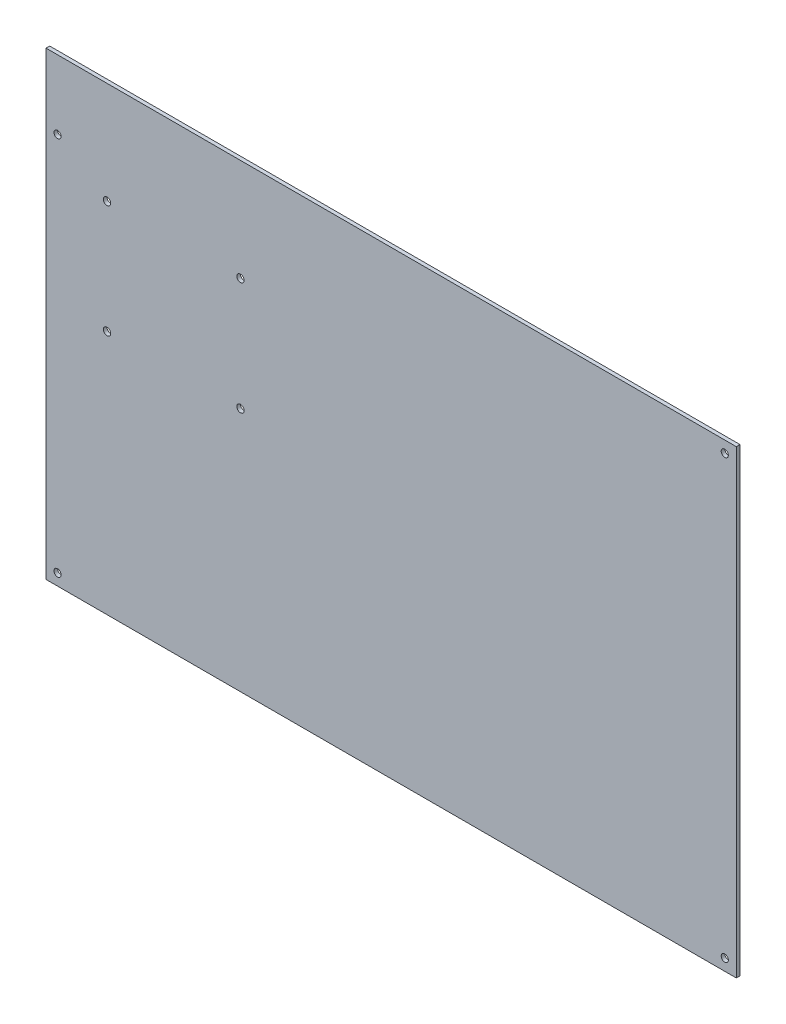
ISO-10303-21;
HEADER;
FILE_DESCRIPTION(('STEP AP214'),'2;1');
FILE_NAME('part.step','',(''),(''),'','','');
FILE_SCHEMA(('AUTOMOTIVE_DESIGN { 1 0 10303 214 1 1 1 1 }'));
ENDSEC;
DATA;
#1=APPLICATION_CONTEXT('core data for automotive mechanical design processes');
#2=APPLICATION_PROTOCOL_DEFINITION('international standard','automotive_design',2000,#1);
#3=PRODUCT_CONTEXT('',#1,'mechanical');
#4=PRODUCT('Part','Part','',(#3));
#5=PRODUCT_RELATED_PRODUCT_CATEGORY('part','',(#4));
#6=PRODUCT_DEFINITION_FORMATION('','',#4);
#7=PRODUCT_DEFINITION_CONTEXT('part definition',#1,'design');
#8=PRODUCT_DEFINITION('design','',#6,#7);
#9=PRODUCT_DEFINITION_SHAPE('','',#8);
#10=(LENGTH_UNIT() NAMED_UNIT(*) SI_UNIT(.MILLI.,.METRE.));
#11=(NAMED_UNIT(*) PLANE_ANGLE_UNIT() SI_UNIT($,.RADIAN.));
#12=(NAMED_UNIT(*) SI_UNIT($,.STERADIAN.) SOLID_ANGLE_UNIT());
#13=UNCERTAINTY_MEASURE_WITH_UNIT(LENGTH_MEASURE(1.E-05),#10,'distance_accuracy_value','');
#14=(GEOMETRIC_REPRESENTATION_CONTEXT(3) GLOBAL_UNCERTAINTY_ASSIGNED_CONTEXT((#13)) GLOBAL_UNIT_ASSIGNED_CONTEXT((#10,
#11,#12)) REPRESENTATION_CONTEXT('',''));
#15=CARTESIAN_POINT('',(0.,0.,0.));
#16=DIRECTION('',(0.,0.,1.));
#17=DIRECTION('',(1.,0.,0.));
#18=AXIS2_PLACEMENT_3D('',#15,#16,#17);
#19=CARTESIAN_POINT('',(0.,0.,1.6));
#20=DIRECTION('',(0.,0.,-1.));
#21=DIRECTION('',(-1.,0.,0.));
#22=AXIS2_PLACEMENT_3D('',#19,#20,#21);
#23=PLANE('',#22);
#24=CARTESIAN_POINT('',(-65.5,55.6,1.6));
#25=DIRECTION('',(0.,0.,1.));
#26=DIRECTION('',(1.,0.,0.));
#27=AXIS2_PLACEMENT_3D('',#24,#25,#26);
#28=CIRCLE('',#27,1.60000000000001);
#29=CARTESIAN_POINT('',(-63.9,55.6,1.6));
#30=VERTEX_POINT('',#29);
#31=EDGE_CURVE('E149',#30,#30,#28,.T.);
#32=ORIENTED_EDGE('',*,*,#31,.F.);
#33=EDGE_LOOP('',(#32));
#34=FACE_BOUND('',#33,.T.);
#35=CARTESIAN_POINT('',(-123.5,6.59999999999997,1.6));
#36=DIRECTION('',(0.,0.,1.));
#37=DIRECTION('',(1.,0.,0.));
#38=AXIS2_PLACEMENT_3D('',#35,#36,#37);
#39=CIRCLE('',#38,1.60000000000001);
#40=CARTESIAN_POINT('',(-121.9,6.59999999999997,1.6));
#41=VERTEX_POINT('',#40);
#42=EDGE_CURVE('E142',#41,#41,#39,.T.);
#43=ORIENTED_EDGE('',*,*,#42,.F.);
#44=EDGE_LOOP('',(#43));
#45=FACE_BOUND('',#44,.T.);
#46=CARTESIAN_POINT('',(-65.5,6.59999999999997,1.6));
#47=DIRECTION('',(0.,0.,1.));
#48=DIRECTION('',(1.,0.,0.));
#49=AXIS2_PLACEMENT_3D('',#46,#47,#48);
#50=CIRCLE('',#49,1.60000000000001);
#51=CARTESIAN_POINT('',(-63.9,6.59999999999997,1.6));
#52=VERTEX_POINT('',#51);
#53=EDGE_CURVE('E154',#52,#52,#50,.T.);
#54=ORIENTED_EDGE('',*,*,#53,.F.);
#55=EDGE_LOOP('',(#54));
#56=FACE_BOUND('',#55,.T.);
#57=CARTESIAN_POINT('',(-123.5,55.6,1.6));
#58=DIRECTION('',(0.,0.,1.));
#59=DIRECTION('',(1.,0.,0.));
#60=AXIS2_PLACEMENT_3D('',#57,#58,#59);
#61=CIRCLE('',#60,1.60000000000001);
#62=CARTESIAN_POINT('',(-121.9,55.6,1.6));
#63=VERTEX_POINT('',#62);
#64=EDGE_CURVE('E136',#63,#63,#61,.T.);
#65=ORIENTED_EDGE('',*,*,#64,.F.);
#66=EDGE_LOOP('',(#65));
#67=FACE_BOUND('',#66,.T.);
#68=DIRECTION('',(0.,1.,0.));
#69=VECTOR('',#68,1.);
#70=CARTESIAN_POINT('',(150.,-100.,1.6));
#71=LINE('',#70,#69);
#72=CARTESIAN_POINT('',(150.,-100.,1.6));
#73=VERTEX_POINT('',#72);
#74=CARTESIAN_POINT('',(150.,100.,1.6));
#75=VERTEX_POINT('',#74);
#76=EDGE_CURVE('E85',#73,#75,#71,.T.);
#77=ORIENTED_EDGE('',*,*,#76,.T.);
#78=DIRECTION('',(-1.,0.,0.));
#79=VECTOR('',#78,1.);
#80=CARTESIAN_POINT('',(-150.,100.,1.6));
#81=LINE('',#80,#79);
#82=CARTESIAN_POINT('',(-150.,100.,1.6));
#83=VERTEX_POINT('',#82);
#84=EDGE_CURVE('E80',#75,#83,#81,.T.);
#85=ORIENTED_EDGE('',*,*,#84,.T.);
#86=DIRECTION('',(0.,-1.,0.));
#87=VECTOR('',#86,1.);
#88=CARTESIAN_POINT('',(-150.,-100.,1.6));
#89=LINE('',#88,#87);
#90=CARTESIAN_POINT('',(-150.,-100.,1.6));
#91=VERTEX_POINT('',#90);
#92=EDGE_CURVE('E83',#83,#91,#89,.T.);
#93=ORIENTED_EDGE('',*,*,#92,.T.);
#94=DIRECTION('',(1.,0.,0.));
#95=VECTOR('',#94,1.);
#96=CARTESIAN_POINT('',(-150.,-100.,1.6));
#97=LINE('',#96,#95);
#98=EDGE_CURVE('E50',#91,#73,#97,.T.);
#99=ORIENTED_EDGE('',*,*,#98,.T.);
#100=EDGE_LOOP('',(#77,#85,#93,#99));
#101=FACE_BOUND('',#100,.T.);
#102=CARTESIAN_POINT('',(-145.,-95.,1.6));
#103=DIRECTION('',(0.,0.,1.));
#104=DIRECTION('',(1.,0.,0.));
#105=AXIS2_PLACEMENT_3D('',#102,#103,#104);
#106=CIRCLE('',#105,1.54999999999999);
#107=CARTESIAN_POINT('',(-143.45,-95.,1.6));
#108=VERTEX_POINT('',#107);
#109=EDGE_CURVE('E100',#108,#108,#106,.T.);
#110=ORIENTED_EDGE('',*,*,#109,.F.);
#111=EDGE_LOOP('',(#110));
#112=FACE_BOUND('',#111,.T.);
#113=CARTESIAN_POINT('',(145.,95.,1.6));
#114=DIRECTION('',(0.,0.,1.));
#115=DIRECTION('',(1.,0.,0.));
#116=AXIS2_PLACEMENT_3D('',#113,#114,#115);
#117=CIRCLE('',#116,1.54999999999999);
#118=CARTESIAN_POINT('',(146.55,95.,1.6));
#119=VERTEX_POINT('',#118);
#120=EDGE_CURVE('E115',#119,#119,#117,.T.);
#121=ORIENTED_EDGE('',*,*,#120,.F.);
#122=EDGE_LOOP('',(#121));
#123=FACE_BOUND('',#122,.T.);
#124=CARTESIAN_POINT('',(145.,-95.,1.6));
#125=DIRECTION('',(0.,0.,1.));
#126=DIRECTION('',(1.,0.,0.));
#127=AXIS2_PLACEMENT_3D('',#124,#125,#126);
#128=CIRCLE('',#127,1.54999999999999);
#129=CARTESIAN_POINT('',(146.55,-95.,1.6));
#130=VERTEX_POINT('',#129);
#131=EDGE_CURVE('E121',#130,#130,#128,.T.);
#132=ORIENTED_EDGE('',*,*,#131,.F.);
#133=EDGE_LOOP('',(#132));
#134=FACE_BOUND('',#133,.T.);
#135=CARTESIAN_POINT('',(-145.,70.,1.6));
#136=DIRECTION('',(0.,0.,1.));
#137=DIRECTION('',(1.,0.,0.));
#138=AXIS2_PLACEMENT_3D('',#135,#136,#137);
#139=CIRCLE('',#138,1.54999999999999);
#140=CARTESIAN_POINT('',(-143.45,70.,1.6));
#141=VERTEX_POINT('',#140);
#142=EDGE_CURVE('E127',#141,#141,#139,.T.);
#143=ORIENTED_EDGE('',*,*,#142,.F.);
#144=EDGE_LOOP('',(#143));
#145=FACE_BOUND('',#144,.T.);
#146=ADVANCED_FACE('F33',(#34,#45,#56,#67,#101,#112,#123,#134,#145),#23,.F.);
#147=CARTESIAN_POINT('',(0.,0.,0.));
#148=DIRECTION('',(0.,0.,-1.));
#149=DIRECTION('',(-1.,0.,0.));
#150=AXIS2_PLACEMENT_3D('',#147,#148,#149);
#151=PLANE('',#150);
#152=CARTESIAN_POINT('',(-65.5,55.6,0.));
#153=DIRECTION('',(0.,0.,1.));
#154=DIRECTION('',(1.,0.,0.));
#155=AXIS2_PLACEMENT_3D('',#152,#153,#154);
#156=CIRCLE('',#155,1.60000000000001);
#157=CARTESIAN_POINT('',(-63.9,55.6,0.));
#158=VERTEX_POINT('',#157);
#159=EDGE_CURVE('E139',#158,#158,#156,.T.);
#160=ORIENTED_EDGE('',*,*,#159,.T.);
#161=EDGE_LOOP('',(#160));
#162=FACE_BOUND('',#161,.T.);
#163=CARTESIAN_POINT('',(-123.5,6.59999999999997,0.));
#164=DIRECTION('',(0.,0.,1.));
#165=DIRECTION('',(1.,0.,0.));
#166=AXIS2_PLACEMENT_3D('',#163,#164,#165);
#167=CIRCLE('',#166,1.60000000000001);
#168=CARTESIAN_POINT('',(-121.9,6.59999999999997,0.));
#169=VERTEX_POINT('',#168);
#170=EDGE_CURVE('E145',#169,#169,#167,.T.);
#171=ORIENTED_EDGE('',*,*,#170,.T.);
#172=EDGE_LOOP('',(#171));
#173=FACE_BOUND('',#172,.T.);
#174=CARTESIAN_POINT('',(-65.5,6.59999999999997,0.));
#175=DIRECTION('',(0.,0.,1.));
#176=DIRECTION('',(1.,0.,0.));
#177=AXIS2_PLACEMENT_3D('',#174,#175,#176);
#178=CIRCLE('',#177,1.60000000000001);
#179=CARTESIAN_POINT('',(-63.9,6.59999999999997,0.));
#180=VERTEX_POINT('',#179);
#181=EDGE_CURVE('E146',#180,#180,#178,.T.);
#182=ORIENTED_EDGE('',*,*,#181,.T.);
#183=EDGE_LOOP('',(#182));
#184=FACE_BOUND('',#183,.T.);
#185=CARTESIAN_POINT('',(-123.5,55.6,0.));
#186=DIRECTION('',(0.,0.,1.));
#187=DIRECTION('',(1.,0.,0.));
#188=AXIS2_PLACEMENT_3D('',#185,#186,#187);
#189=CIRCLE('',#188,1.60000000000001);
#190=CARTESIAN_POINT('',(-121.9,55.6,0.));
#191=VERTEX_POINT('',#190);
#192=EDGE_CURVE('E133',#191,#191,#189,.T.);
#193=ORIENTED_EDGE('',*,*,#192,.T.);
#194=EDGE_LOOP('',(#193));
#195=FACE_BOUND('',#194,.T.);
#196=CARTESIAN_POINT('',(145.,-95.,0.));
#197=DIRECTION('',(0.,0.,1.));
#198=DIRECTION('',(1.,0.,0.));
#199=AXIS2_PLACEMENT_3D('',#196,#197,#198);
#200=CIRCLE('',#199,1.54999999999999);
#201=CARTESIAN_POINT('',(146.55,-95.,0.));
#202=VERTEX_POINT('',#201);
#203=EDGE_CURVE('E124',#202,#202,#200,.T.);
#204=ORIENTED_EDGE('',*,*,#203,.T.);
#205=EDGE_LOOP('',(#204));
#206=FACE_BOUND('',#205,.T.);
#207=CARTESIAN_POINT('',(-145.,-95.,0.));
#208=DIRECTION('',(0.,0.,1.));
#209=DIRECTION('',(1.,0.,0.));
#210=AXIS2_PLACEMENT_3D('',#207,#208,#209);
#211=CIRCLE('',#210,1.54999999999999);
#212=CARTESIAN_POINT('',(-143.45,-95.,0.));
#213=VERTEX_POINT('',#212);
#214=EDGE_CURVE('E112',#213,#213,#211,.T.);
#215=ORIENTED_EDGE('',*,*,#214,.T.);
#216=EDGE_LOOP('',(#215));
#217=FACE_BOUND('',#216,.T.);
#218=DIRECTION('',(0.,1.,0.));
#219=VECTOR('',#218,1.);
#220=CARTESIAN_POINT('',(150.,-100.,0.));
#221=LINE('',#220,#219);
#222=CARTESIAN_POINT('',(150.,-100.,0.));
#223=VERTEX_POINT('',#222);
#224=CARTESIAN_POINT('',(150.,100.,0.));
#225=VERTEX_POINT('',#224);
#226=EDGE_CURVE('E97',#223,#225,#221,.T.);
#227=ORIENTED_EDGE('',*,*,#226,.F.);
#228=DIRECTION('',(1.,0.,0.));
#229=VECTOR('',#228,1.);
#230=CARTESIAN_POINT('',(-150.,-100.,0.));
#231=LINE('',#230,#229);
#232=CARTESIAN_POINT('',(-150.,-100.,0.));
#233=VERTEX_POINT('',#232);
#234=EDGE_CURVE('E73',#233,#223,#231,.T.);
#235=ORIENTED_EDGE('',*,*,#234,.F.);
#236=DIRECTION('',(0.,-1.,0.));
#237=VECTOR('',#236,1.);
#238=CARTESIAN_POINT('',(-150.,-100.,0.));
#239=LINE('',#238,#237);
#240=CARTESIAN_POINT('',(-150.,100.,0.));
#241=VERTEX_POINT('',#240);
#242=EDGE_CURVE('E67',#241,#233,#239,.T.);
#243=ORIENTED_EDGE('',*,*,#242,.F.);
#244=DIRECTION('',(-1.,0.,0.));
#245=VECTOR('',#244,1.);
#246=CARTESIAN_POINT('',(-150.,100.,0.));
#247=LINE('',#246,#245);
#248=EDGE_CURVE('E89',#225,#241,#247,.T.);
#249=ORIENTED_EDGE('',*,*,#248,.F.);
#250=EDGE_LOOP('',(#227,#235,#243,#249));
#251=FACE_BOUND('',#250,.T.);
#252=CARTESIAN_POINT('',(145.,95.,0.));
#253=DIRECTION('',(0.,0.,1.));
#254=DIRECTION('',(1.,0.,0.));
#255=AXIS2_PLACEMENT_3D('',#252,#253,#254);
#256=CIRCLE('',#255,1.54999999999999);
#257=CARTESIAN_POINT('',(146.55,95.,0.));
#258=VERTEX_POINT('',#257);
#259=EDGE_CURVE('E118',#258,#258,#256,.T.);
#260=ORIENTED_EDGE('',*,*,#259,.T.);
#261=EDGE_LOOP('',(#260));
#262=FACE_BOUND('',#261,.T.);
#263=CARTESIAN_POINT('',(-145.,70.,0.));
#264=DIRECTION('',(0.,0.,1.));
#265=DIRECTION('',(1.,0.,0.));
#266=AXIS2_PLACEMENT_3D('',#263,#264,#265);
#267=CIRCLE('',#266,1.54999999999999);
#268=CARTESIAN_POINT('',(-143.45,70.,0.));
#269=VERTEX_POINT('',#268);
#270=EDGE_CURVE('E130',#269,#269,#267,.T.);
#271=ORIENTED_EDGE('',*,*,#270,.T.);
#272=EDGE_LOOP('',(#271));
#273=FACE_BOUND('',#272,.T.);
#274=ADVANCED_FACE('F108',(#162,#173,#184,#195,#206,#217,#251,#262,#273),#151,.T.);
#275=CARTESIAN_POINT('',(150.,-100.,1.6));
#276=DIRECTION('',(-1.,0.,0.));
#277=DIRECTION('',(0.,0.,1.));
#278=AXIS2_PLACEMENT_3D('',#275,#276,#277);
#279=PLANE('',#278);
#280=ORIENTED_EDGE('',*,*,#226,.T.);
#281=DIRECTION('',(0.,0.,-1.));
#282=VECTOR('',#281,1.);
#283=CARTESIAN_POINT('',(150.,100.,1.6));
#284=LINE('',#283,#282);
#285=EDGE_CURVE('E11',#75,#225,#284,.T.);
#286=ORIENTED_EDGE('',*,*,#285,.F.);
#287=ORIENTED_EDGE('',*,*,#76,.F.);
#288=DIRECTION('',(0.,0.,-1.));
#289=VECTOR('',#288,1.);
#290=CARTESIAN_POINT('',(150.,-100.,1.6));
#291=LINE('',#290,#289);
#292=EDGE_CURVE('E93',#73,#223,#291,.T.);
#293=ORIENTED_EDGE('',*,*,#292,.T.);
#294=EDGE_LOOP('',(#280,#286,#287,#293));
#295=FACE_BOUND('',#294,.T.);
#296=ADVANCED_FACE('F35',(#295),#279,.F.);
#297=CARTESIAN_POINT('',(-150.,100.,1.6));
#298=DIRECTION('',(0.,-1.,0.));
#299=DIRECTION('',(0.,0.,-1.));
#300=AXIS2_PLACEMENT_3D('',#297,#298,#299);
#301=PLANE('',#300);
#302=ORIENTED_EDGE('',*,*,#248,.T.);
#303=DIRECTION('',(0.,0.,-1.));
#304=VECTOR('',#303,1.);
#305=CARTESIAN_POINT('',(-150.,100.,1.6));
#306=LINE('',#305,#304);
#307=EDGE_CURVE('E42',#83,#241,#306,.T.);
#308=ORIENTED_EDGE('',*,*,#307,.F.);
#309=ORIENTED_EDGE('',*,*,#84,.F.);
#310=ORIENTED_EDGE('',*,*,#285,.T.);
#311=EDGE_LOOP('',(#302,#308,#309,#310));
#312=FACE_BOUND('',#311,.T.);
#313=ADVANCED_FACE('F88',(#312),#301,.F.);
#314=CARTESIAN_POINT('',(-150.,-100.,1.6));
#315=DIRECTION('',(1.,0.,0.));
#316=DIRECTION('',(0.,0.,-1.));
#317=AXIS2_PLACEMENT_3D('',#314,#315,#316);
#318=PLANE('',#317);
#319=ORIENTED_EDGE('',*,*,#242,.T.);
#320=DIRECTION('',(0.,0.,-1.));
#321=VECTOR('',#320,1.);
#322=CARTESIAN_POINT('',(-150.,-100.,1.6));
#323=LINE('',#322,#321);
#324=EDGE_CURVE('E90',#91,#233,#323,.T.);
#325=ORIENTED_EDGE('',*,*,#324,.F.);
#326=ORIENTED_EDGE('',*,*,#92,.F.);
#327=ORIENTED_EDGE('',*,*,#307,.T.);
#328=EDGE_LOOP('',(#319,#325,#326,#327));
#329=FACE_BOUND('',#328,.T.);
#330=ADVANCED_FACE('F91',(#329),#318,.F.);
#331=CARTESIAN_POINT('',(-150.,-100.,1.6));
#332=DIRECTION('',(0.,1.,0.));
#333=DIRECTION('',(0.,0.,1.));
#334=AXIS2_PLACEMENT_3D('',#331,#332,#333);
#335=PLANE('',#334);
#336=ORIENTED_EDGE('',*,*,#234,.T.);
#337=ORIENTED_EDGE('',*,*,#292,.F.);
#338=ORIENTED_EDGE('',*,*,#98,.F.);
#339=ORIENTED_EDGE('',*,*,#324,.T.);
#340=EDGE_LOOP('',(#336,#337,#338,#339));
#341=FACE_BOUND('',#340,.T.);
#342=ADVANCED_FACE('F105',(#341),#335,.F.);
#343=CARTESIAN_POINT('',(-145.,-95.,1.6));
#344=DIRECTION('',(0.,0.,-1.));
#345=DIRECTION('',(-1.,0.,0.));
#346=AXIS2_PLACEMENT_3D('',#343,#344,#345);
#347=CYLINDRICAL_SURFACE('',#346,1.54999999999999);
#348=ORIENTED_EDGE('',*,*,#109,.T.);
#349=EDGE_LOOP('',(#348));
#350=FACE_BOUND('',#349,.T.);
#351=ORIENTED_EDGE('',*,*,#214,.F.);
#352=EDGE_LOOP('',(#351));
#353=FACE_BOUND('',#352,.T.);
#354=ADVANCED_FACE('F196',(#350,#353),#347,.F.);
#355=CARTESIAN_POINT('',(145.,95.,1.6));
#356=DIRECTION('',(0.,0.,-1.));
#357=DIRECTION('',(-1.,0.,0.));
#358=AXIS2_PLACEMENT_3D('',#355,#356,#357);
#359=CYLINDRICAL_SURFACE('',#358,1.54999999999999);
#360=ORIENTED_EDGE('',*,*,#120,.T.);
#361=EDGE_LOOP('',(#360));
#362=FACE_BOUND('',#361,.T.);
#363=ORIENTED_EDGE('',*,*,#259,.F.);
#364=EDGE_LOOP('',(#363));
#365=FACE_BOUND('',#364,.T.);
#366=ADVANCED_FACE('F192',(#362,#365),#359,.F.);
#367=CARTESIAN_POINT('',(145.,-95.,1.6));
#368=DIRECTION('',(0.,0.,-1.));
#369=DIRECTION('',(-1.,0.,0.));
#370=AXIS2_PLACEMENT_3D('',#367,#368,#369);
#371=CYLINDRICAL_SURFACE('',#370,1.54999999999999);
#372=ORIENTED_EDGE('',*,*,#131,.T.);
#373=EDGE_LOOP('',(#372));
#374=FACE_BOUND('',#373,.T.);
#375=ORIENTED_EDGE('',*,*,#203,.F.);
#376=EDGE_LOOP('',(#375));
#377=FACE_BOUND('',#376,.T.);
#378=ADVANCED_FACE('F183',(#374,#377),#371,.F.);
#379=CARTESIAN_POINT('',(-145.,70.,1.6));
#380=DIRECTION('',(0.,0.,-1.));
#381=DIRECTION('',(-1.,0.,0.));
#382=AXIS2_PLACEMENT_3D('',#379,#380,#381);
#383=CYLINDRICAL_SURFACE('',#382,1.54999999999999);
#384=ORIENTED_EDGE('',*,*,#142,.T.);
#385=EDGE_LOOP('',(#384));
#386=FACE_BOUND('',#385,.T.);
#387=ORIENTED_EDGE('',*,*,#270,.F.);
#388=EDGE_LOOP('',(#387));
#389=FACE_BOUND('',#388,.T.);
#390=ADVANCED_FACE('F177',(#386,#389),#383,.F.);
#391=CARTESIAN_POINT('',(-123.5,55.6,0.));
#392=DIRECTION('',(0.,0.,1.));
#393=DIRECTION('',(1.,0.,0.));
#394=AXIS2_PLACEMENT_3D('',#391,#392,#393);
#395=CYLINDRICAL_SURFACE('',#394,1.60000000000001);
#396=ORIENTED_EDGE('',*,*,#192,.F.);
#397=EDGE_LOOP('',(#396));
#398=FACE_BOUND('',#397,.T.);
#399=ORIENTED_EDGE('',*,*,#64,.T.);
#400=EDGE_LOOP('',(#399));
#401=FACE_BOUND('',#400,.T.);
#402=ADVANCED_FACE('F166',(#398,#401),#395,.F.);
#403=CARTESIAN_POINT('',(-65.5,6.59999999999997,0.));
#404=DIRECTION('',(0.,0.,1.));
#405=DIRECTION('',(1.,0.,0.));
#406=AXIS2_PLACEMENT_3D('',#403,#404,#405);
#407=CYLINDRICAL_SURFACE('',#406,1.60000000000001);
#408=ORIENTED_EDGE('',*,*,#181,.F.);
#409=EDGE_LOOP('',(#408));
#410=FACE_BOUND('',#409,.T.);
#411=ORIENTED_EDGE('',*,*,#53,.T.);
#412=EDGE_LOOP('',(#411));
#413=FACE_BOUND('',#412,.T.);
#414=ADVANCED_FACE('F162',(#410,#413),#407,.F.);
#415=CARTESIAN_POINT('',(-123.5,6.59999999999997,0.));
#416=DIRECTION('',(0.,0.,1.));
#417=DIRECTION('',(1.,0.,0.));
#418=AXIS2_PLACEMENT_3D('',#415,#416,#417);
#419=CYLINDRICAL_SURFACE('',#418,1.60000000000001);
#420=ORIENTED_EDGE('',*,*,#170,.F.);
#421=EDGE_LOOP('',(#420));
#422=FACE_BOUND('',#421,.T.);
#423=ORIENTED_EDGE('',*,*,#42,.T.);
#424=EDGE_LOOP('',(#423));
#425=FACE_BOUND('',#424,.T.);
#426=ADVANCED_FACE('F165',(#422,#425),#419,.F.);
#427=CARTESIAN_POINT('',(-65.5,55.6,0.));
#428=DIRECTION('',(0.,0.,1.));
#429=DIRECTION('',(1.,0.,0.));
#430=AXIS2_PLACEMENT_3D('',#427,#428,#429);
#431=CYLINDRICAL_SURFACE('',#430,1.60000000000001);
#432=ORIENTED_EDGE('',*,*,#159,.F.);
#433=EDGE_LOOP('',(#432));
#434=FACE_BOUND('',#433,.T.);
#435=ORIENTED_EDGE('',*,*,#31,.T.);
#436=EDGE_LOOP('',(#435));
#437=FACE_BOUND('',#436,.T.);
#438=ADVANCED_FACE('F284',(#434,#437),#431,.F.);
#439=CLOSED_SHELL('',(#146,#274,#296,#313,#330,#342,#354,#366,#378,#390,#402,#414,#426,#438));
#440=MANIFOLD_SOLID_BREP('B2',#439);
#441=ADVANCED_BREP_SHAPE_REPRESENTATION('',(#18,#440),#14);
#442=SHAPE_DEFINITION_REPRESENTATION(#9,#441);
ENDSEC;
END-ISO-10303-21;
